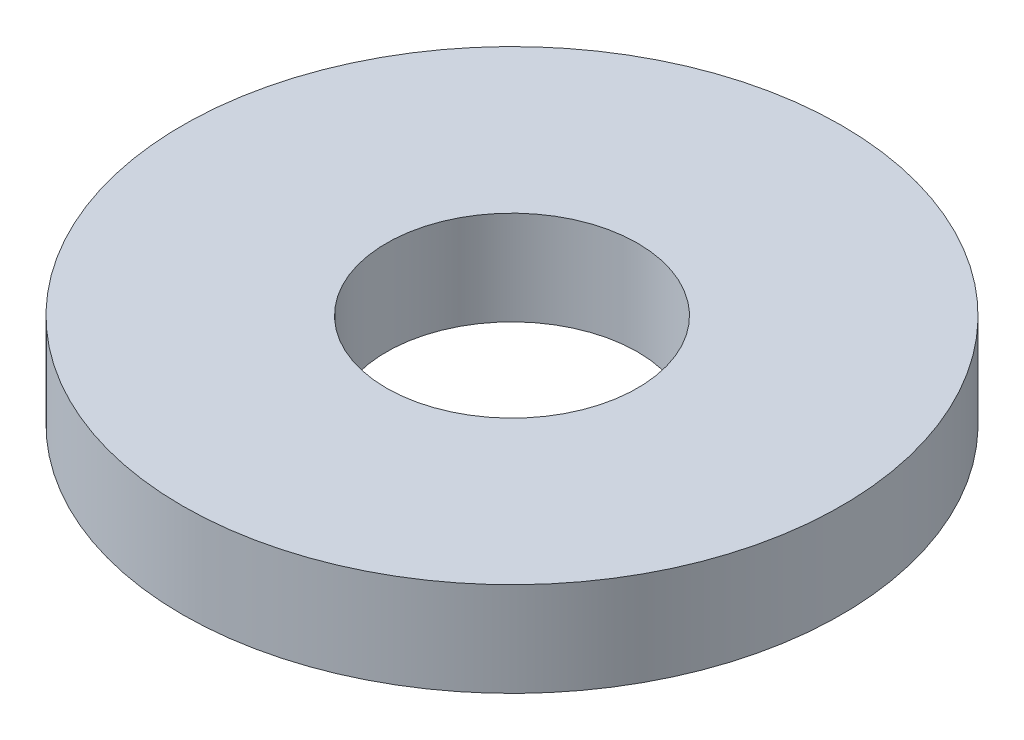
ISO-10303-21;
HEADER;
FILE_DESCRIPTION(('STEP AP214'),'2;1');
FILE_NAME('part.step','',(''),(''),'','','');
FILE_SCHEMA(('AUTOMOTIVE_DESIGN { 1 0 10303 214 1 1 1 1 }'));
ENDSEC;
DATA;
#1=APPLICATION_CONTEXT('core data for automotive mechanical design processes');
#2=APPLICATION_PROTOCOL_DEFINITION('international standard','automotive_design',2000,#1);
#3=PRODUCT_CONTEXT('',#1,'mechanical');
#4=PRODUCT('Part','Part','',(#3));
#5=PRODUCT_RELATED_PRODUCT_CATEGORY('part','',(#4));
#6=PRODUCT_DEFINITION_FORMATION('','',#4);
#7=PRODUCT_DEFINITION_CONTEXT('part definition',#1,'design');
#8=PRODUCT_DEFINITION('design','',#6,#7);
#9=PRODUCT_DEFINITION_SHAPE('','',#8);
#10=(LENGTH_UNIT() NAMED_UNIT(*) SI_UNIT(.MILLI.,.METRE.));
#11=(NAMED_UNIT(*) PLANE_ANGLE_UNIT() SI_UNIT($,.RADIAN.));
#12=(NAMED_UNIT(*) SI_UNIT($,.STERADIAN.) SOLID_ANGLE_UNIT());
#13=UNCERTAINTY_MEASURE_WITH_UNIT(LENGTH_MEASURE(1.E-05),#10,'distance_accuracy_value','');
#14=(GEOMETRIC_REPRESENTATION_CONTEXT(3) GLOBAL_UNCERTAINTY_ASSIGNED_CONTEXT((#13)) GLOBAL_UNIT_ASSIGNED_CONTEXT((#10,
#11,#12)) REPRESENTATION_CONTEXT('',''));
#15=CARTESIAN_POINT('',(0.,0.,0.));
#16=DIRECTION('',(0.,0.,1.));
#17=DIRECTION('',(1.,0.,0.));
#18=AXIS2_PLACEMENT_3D('',#15,#16,#17);
#19=CARTESIAN_POINT('',(0.,3.,0.));
#20=DIRECTION('',(0.,1.,0.));
#21=DIRECTION('',(0.,0.,1.));
#22=AXIS2_PLACEMENT_3D('',#19,#20,#21);
#23=PLANE('',#22);
#24=CARTESIAN_POINT('',(0.,3.,0.));
#25=DIRECTION('',(0.,1.,0.));
#26=DIRECTION('',(0.,0.,1.));
#27=AXIS2_PLACEMENT_3D('',#24,#25,#26);
#28=CIRCLE('',#27,10.5);
#29=CARTESIAN_POINT('',(0.,3.,10.5));
#30=VERTEX_POINT('',#29);
#31=EDGE_CURVE('E10',#30,#30,#28,.T.);
#32=ORIENTED_EDGE('',*,*,#31,.T.);
#33=EDGE_LOOP('',(#32));
#34=FACE_BOUND('',#33,.T.);
#35=CARTESIAN_POINT('',(0.,3.,0.));
#36=DIRECTION('',(0.,1.,0.));
#37=DIRECTION('',(0.,0.,1.));
#38=AXIS2_PLACEMENT_3D('',#35,#36,#37);
#39=CIRCLE('',#38,4.);
#40=CARTESIAN_POINT('',(0.,3.,4.));
#41=VERTEX_POINT('',#40);
#42=EDGE_CURVE('E54',#41,#41,#39,.T.);
#43=ORIENTED_EDGE('',*,*,#42,.F.);
#44=EDGE_LOOP('',(#43));
#45=FACE_BOUND('',#44,.T.);
#46=ADVANCED_FACE('F41',(#34,#45),#23,.T.);
#47=CARTESIAN_POINT('',(0.,0.,0.));
#48=DIRECTION('',(0.,1.,0.));
#49=DIRECTION('',(0.,0.,1.));
#50=AXIS2_PLACEMENT_3D('',#47,#48,#49);
#51=PLANE('',#50);
#52=CARTESIAN_POINT('',(0.,0.,0.));
#53=DIRECTION('',(0.,1.,0.));
#54=DIRECTION('',(0.,0.,1.));
#55=AXIS2_PLACEMENT_3D('',#52,#53,#54);
#56=CIRCLE('',#55,10.5);
#57=CARTESIAN_POINT('',(0.,0.,10.5));
#58=VERTEX_POINT('',#57);
#59=EDGE_CURVE('E45',#58,#58,#56,.T.);
#60=ORIENTED_EDGE('',*,*,#59,.F.);
#61=EDGE_LOOP('',(#60));
#62=FACE_BOUND('',#61,.T.);
#63=CARTESIAN_POINT('',(0.,0.,0.));
#64=DIRECTION('',(0.,1.,0.));
#65=DIRECTION('',(0.,0.,1.));
#66=AXIS2_PLACEMENT_3D('',#63,#64,#65);
#67=CIRCLE('',#66,4.);
#68=CARTESIAN_POINT('',(0.,0.,4.));
#69=VERTEX_POINT('',#68);
#70=EDGE_CURVE('E56',#69,#69,#67,.T.);
#71=ORIENTED_EDGE('',*,*,#70,.T.);
#72=EDGE_LOOP('',(#71));
#73=FACE_BOUND('',#72,.T.);
#74=ADVANCED_FACE('F68',(#62,#73),#51,.F.);
#75=CARTESIAN_POINT('',(0.,3.,0.));
#76=DIRECTION('',(0.,-1.,0.));
#77=DIRECTION('',(0.,0.,-1.));
#78=AXIS2_PLACEMENT_3D('',#75,#76,#77);
#79=CYLINDRICAL_SURFACE('',#78,10.5);
#80=ORIENTED_EDGE('',*,*,#31,.F.);
#81=EDGE_LOOP('',(#80));
#82=FACE_BOUND('',#81,.T.);
#83=ORIENTED_EDGE('',*,*,#59,.T.);
#84=EDGE_LOOP('',(#83));
#85=FACE_BOUND('',#84,.T.);
#86=ADVANCED_FACE('F43',(#82,#85),#79,.T.);
#87=CARTESIAN_POINT('',(0.,3.,0.));
#88=DIRECTION('',(0.,-1.,0.));
#89=DIRECTION('',(0.,0.,-1.));
#90=AXIS2_PLACEMENT_3D('',#87,#88,#89);
#91=CYLINDRICAL_SURFACE('',#90,4.);
#92=ORIENTED_EDGE('',*,*,#42,.T.);
#93=EDGE_LOOP('',(#92));
#94=FACE_BOUND('',#93,.T.);
#95=ORIENTED_EDGE('',*,*,#70,.F.);
#96=EDGE_LOOP('',(#95));
#97=FACE_BOUND('',#96,.T.);
#98=ADVANCED_FACE('F64',(#94,#97),#91,.F.);
#99=CLOSED_SHELL('',(#46,#74,#86,#98));
#100=MANIFOLD_SOLID_BREP('B2',#99);
#101=ADVANCED_BREP_SHAPE_REPRESENTATION('',(#18,#100),#14);
#102=SHAPE_DEFINITION_REPRESENTATION(#9,#101);
ENDSEC;
END-ISO-10303-21;
